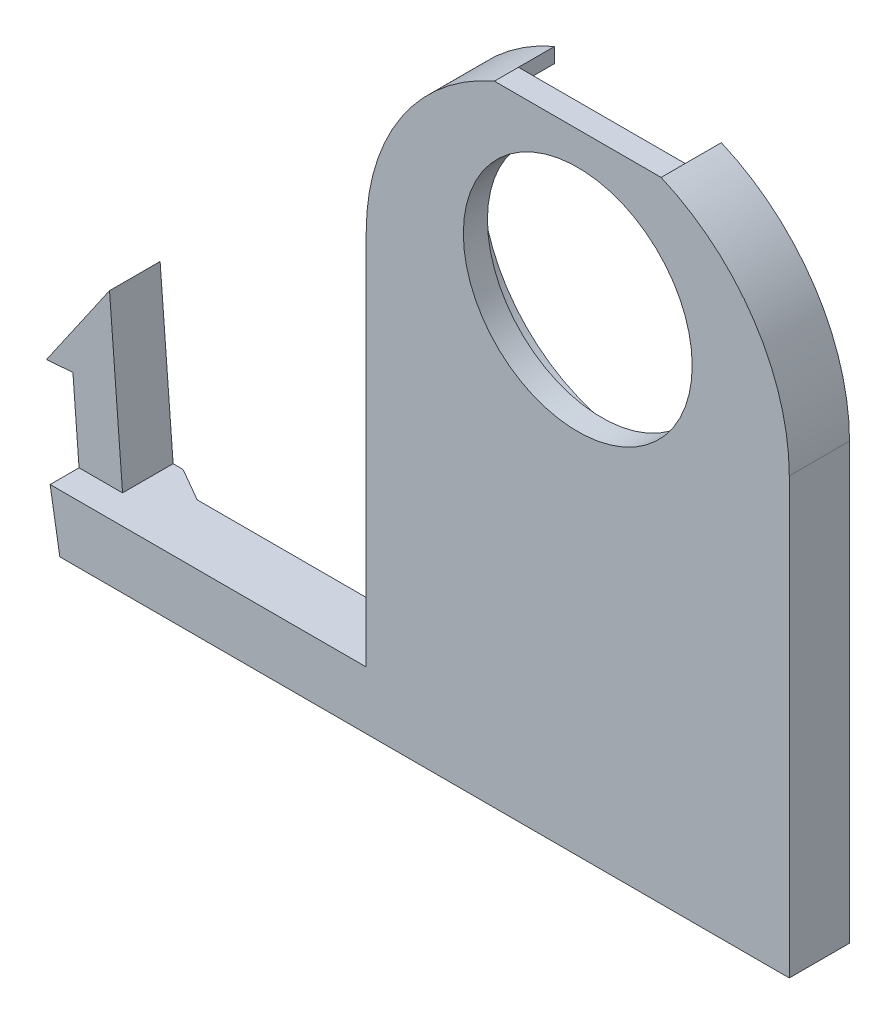
ISO-10303-21;
HEADER;
FILE_DESCRIPTION(('STEP AP214'),'2;1');
FILE_NAME('part.step','',(''),(''),'','','');
FILE_SCHEMA(('AUTOMOTIVE_DESIGN { 1 0 10303 214 1 1 1 1 }'));
ENDSEC;
DATA;
#1=APPLICATION_CONTEXT('core data for automotive mechanical design processes');
#2=APPLICATION_PROTOCOL_DEFINITION('international standard','automotive_design',2000,#1);
#3=PRODUCT_CONTEXT('',#1,'mechanical');
#4=PRODUCT('Part','Part','',(#3));
#5=PRODUCT_RELATED_PRODUCT_CATEGORY('part','',(#4));
#6=PRODUCT_DEFINITION_FORMATION('','',#4);
#7=PRODUCT_DEFINITION_CONTEXT('part definition',#1,'design');
#8=PRODUCT_DEFINITION('design','',#6,#7);
#9=PRODUCT_DEFINITION_SHAPE('','',#8);
#10=(LENGTH_UNIT() NAMED_UNIT(*) SI_UNIT(.MILLI.,.METRE.));
#11=(NAMED_UNIT(*) PLANE_ANGLE_UNIT() SI_UNIT($,.RADIAN.));
#12=(NAMED_UNIT(*) SI_UNIT($,.STERADIAN.) SOLID_ANGLE_UNIT());
#13=UNCERTAINTY_MEASURE_WITH_UNIT(LENGTH_MEASURE(1.E-05),#10,'distance_accuracy_value','');
#14=(GEOMETRIC_REPRESENTATION_CONTEXT(3) GLOBAL_UNCERTAINTY_ASSIGNED_CONTEXT((#13)) GLOBAL_UNIT_ASSIGNED_CONTEXT((#10,
#11,#12)) REPRESENTATION_CONTEXT('',''));
#15=CARTESIAN_POINT('',(0.,0.,0.));
#16=DIRECTION('',(0.,0.,1.));
#17=DIRECTION('',(1.,0.,0.));
#18=AXIS2_PLACEMENT_3D('',#15,#16,#17);
#19=CARTESIAN_POINT('',(0.,0.,1.3));
#20=DIRECTION('',(0.,0.,-1.));
#21=DIRECTION('',(-1.,0.,0.));
#22=AXIS2_PLACEMENT_3D('',#19,#20,#21);
#23=PLANE('',#22);
#24=DIRECTION('',(-0.0769745555350215,0.997033057526272,0.));
#25=VECTOR('',#24,1.);
#26=CARTESIAN_POINT('',(-13.1211903085665,-9.1,1.3));
#27=LINE('',#26,#25);
#28=CARTESIAN_POINT('',(-13.1211903085665,-9.1,1.3));
#29=VERTEX_POINT('',#28);
#30=CARTESIAN_POINT('',(-13.3759622354832,-5.8,1.3));
#31=VERTEX_POINT('',#30);
#32=EDGE_CURVE('E166',#29,#31,#27,.T.);
#33=ORIENTED_EDGE('',*,*,#32,.F.);
#34=DIRECTION('',(-1.,0.,0.));
#35=VECTOR('',#34,1.);
#36=CARTESIAN_POINT('',(-12.72,-9.1,1.3));
#37=LINE('',#36,#35);
#38=CARTESIAN_POINT('',(-11.3158339200171,-9.1,1.3));
#39=VERTEX_POINT('',#38);
#40=EDGE_CURVE('E150',#39,#29,#37,.T.);
#41=ORIENTED_EDGE('',*,*,#40,.F.);
#42=DIRECTION('',(0.0769745555350218,-0.997033057526272,0.));
#43=VECTOR('',#42,1.);
#44=CARTESIAN_POINT('',(-11.8562592195373,-2.1,1.3));
#45=LINE('',#44,#43);
#46=CARTESIAN_POINT('',(-11.8562592195373,-2.1,1.3));
#47=VERTEX_POINT('',#46);
#48=EDGE_CURVE('E162',#47,#39,#45,.T.);
#49=ORIENTED_EDGE('',*,*,#48,.F.);
#50=DIRECTION('',(0.568663566892259,0.822570208364839,0.));
#51=VECTOR('',#50,1.);
#52=CARTESIAN_POINT('',(-14.4726985987621,-5.88467201108852,1.3));
#53=LINE('',#52,#51);
#54=CARTESIAN_POINT('',(-14.4726985987621,-5.88467201108852,1.3));
#55=VERTEX_POINT('',#54);
#56=EDGE_CURVE('E194',#55,#47,#53,.T.);
#57=ORIENTED_EDGE('',*,*,#56,.F.);
#58=DIRECTION('',(-0.997033057526272,-0.0769745555350211,0.));
#59=VECTOR('',#58,1.);
#60=CARTESIAN_POINT('',(-13.3759622354832,-5.8,1.3));
#61=LINE('',#60,#59);
#62=EDGE_CURVE('E170',#31,#55,#61,.T.);
#63=ORIENTED_EDGE('',*,*,#62,.F.);
#64=EDGE_LOOP('',(#33,#41,#49,#57,#63));
#65=FACE_BOUND('',#64,.T.);
#66=ADVANCED_FACE('F35',(#65),#23,.F.);
#67=CARTESIAN_POINT('',(0.,0.,0.));
#68=DIRECTION('',(0.,0.,1.));
#69=DIRECTION('',(1.,0.,0.));
#70=AXIS2_PLACEMENT_3D('',#67,#68,#69);
#71=PLANE('',#70);
#72=DIRECTION('',(1.,0.,0.));
#73=VECTOR('',#72,1.);
#74=CARTESIAN_POINT('',(0.,-11.5,0.));
#75=LINE('',#74,#73);
#76=CARTESIAN_POINT('',(-9.51583392001713,-11.5,0.));
#77=VERTEX_POINT('',#76);
#78=CARTESIAN_POINT('',(17.56,-11.5,0.));
#79=VERTEX_POINT('',#78);
#80=EDGE_CURVE('E224',#77,#79,#75,.T.);
#81=ORIENTED_EDGE('',*,*,#80,.F.);
#82=DIRECTION('',(0.,1.,0.));
#83=VECTOR('',#82,1.);
#84=CARTESIAN_POINT('',(-9.51583392001713,-9.1,0.));
#85=LINE('',#84,#83);
#86=CARTESIAN_POINT('',(-9.51583392001713,-9.1,0.));
#87=VERTEX_POINT('',#86);
#88=EDGE_CURVE('E298',#77,#87,#85,.T.);
#89=ORIENTED_EDGE('',*,*,#88,.T.);
#90=DIRECTION('',(1.,0.,0.));
#91=VECTOR('',#90,1.);
#92=CARTESIAN_POINT('',(-12.72,-9.1,0.));
#93=LINE('',#92,#91);
#94=CARTESIAN_POINT('',(0.,-9.1,0.));
#95=VERTEX_POINT('',#94);
#96=EDGE_CURVE('E215',#87,#95,#93,.T.);
#97=ORIENTED_EDGE('',*,*,#96,.T.);
#98=DIRECTION('',(0.,1.,0.));
#99=VECTOR('',#98,1.);
#100=CARTESIAN_POINT('',(0.,0.,0.));
#101=LINE('',#100,#99);
#102=CARTESIAN_POINT('',(0.,6.55,0.));
#103=VERTEX_POINT('',#102);
#104=EDGE_CURVE('E275',#95,#103,#101,.T.);
#105=ORIENTED_EDGE('',*,*,#104,.T.);
#106=CARTESIAN_POINT('',(8.78,6.55,0.));
#107=DIRECTION('',(0.,0.,1.));
#108=DIRECTION('',(1.,0.,0.));
#109=AXIS2_PLACEMENT_3D('',#106,#107,#108);
#110=CIRCLE('',#109,8.78);
#111=CARTESIAN_POINT('',(5.32,14.6194981256581,0.));
#112=VERTEX_POINT('',#111);
#113=EDGE_CURVE('E272',#112,#103,#110,.T.);
#114=ORIENTED_EDGE('',*,*,#113,.F.);
#115=DIRECTION('',(0.,1.,0.));
#116=VECTOR('',#115,1.);
#117=CARTESIAN_POINT('',(5.32,0.,0.));
#118=LINE('',#117,#116);
#119=CARTESIAN_POINT('',(5.32,14.0025812124856,0.));
#120=VERTEX_POINT('',#119);
#121=EDGE_CURVE('E270',#120,#112,#118,.T.);
#122=ORIENTED_EDGE('',*,*,#121,.F.);
#123=CARTESIAN_POINT('',(8.78,8.5,0.));
#124=DIRECTION('',(0.,0.,1.));
#125=DIRECTION('',(1.,0.,0.));
#126=AXIS2_PLACEMENT_3D('',#123,#124,#125);
#127=CIRCLE('',#126,6.5);
#128=CARTESIAN_POINT('',(12.24,14.0025812124856,0.));
#129=VERTEX_POINT('',#128);
#130=EDGE_CURVE('E257',#120,#129,#127,.T.);
#131=ORIENTED_EDGE('',*,*,#130,.T.);
#132=DIRECTION('',(0.,1.,0.));
#133=VECTOR('',#132,1.);
#134=CARTESIAN_POINT('',(12.24,0.,0.));
#135=LINE('',#134,#133);
#136=CARTESIAN_POINT('',(12.24,14.6194981256581,0.));
#137=VERTEX_POINT('',#136);
#138=EDGE_CURVE('E262',#129,#137,#135,.T.);
#139=ORIENTED_EDGE('',*,*,#138,.T.);
#140=CARTESIAN_POINT('',(8.78,6.55,0.));
#141=DIRECTION('',(0.,0.,1.));
#142=DIRECTION('',(1.,0.,0.));
#143=AXIS2_PLACEMENT_3D('',#140,#141,#142);
#144=CIRCLE('',#143,8.78);
#145=CARTESIAN_POINT('',(17.56,6.55,0.));
#146=VERTEX_POINT('',#145);
#147=EDGE_CURVE('E279',#146,#137,#144,.T.);
#148=ORIENTED_EDGE('',*,*,#147,.F.);
#149=DIRECTION('',(0.,1.,0.));
#150=VECTOR('',#149,1.);
#151=CARTESIAN_POINT('',(17.56,0.,0.));
#152=LINE('',#151,#150);
#153=EDGE_CURVE('E277',#79,#146,#152,.T.);
#154=ORIENTED_EDGE('',*,*,#153,.F.);
#155=EDGE_LOOP('',(#81,#89,#97,#105,#114,#122,#131,#139,#148,#154));
#156=FACE_BOUND('',#155,.T.);
#157=ADVANCED_FACE('F314',(#156),#71,.F.);
#158=CARTESIAN_POINT('',(-12.72,-9.1,0.));
#159=DIRECTION('',(0.,-1.,0.));
#160=DIRECTION('',(0.,0.,-1.));
#161=AXIS2_PLACEMENT_3D('',#158,#159,#160);
#162=PLANE('',#161);
#163=DIRECTION('',(0.,0.,1.));
#164=VECTOR('',#163,1.);
#165=CARTESIAN_POINT('',(-11.3158339200171,-9.1,-0.8));
#166=LINE('',#165,#164);
#167=CARTESIAN_POINT('',(-11.3158339200171,-9.1,-0.8));
#168=VERTEX_POINT('',#167);
#169=EDGE_CURVE('E157',#168,#39,#166,.T.);
#170=ORIENTED_EDGE('',*,*,#169,.T.);
#171=ORIENTED_EDGE('',*,*,#40,.T.);
#172=DIRECTION('',(0.,0.,-1.));
#173=VECTOR('',#172,1.);
#174=CARTESIAN_POINT('',(-13.1211903085665,-9.1,4.93330098090797));
#175=LINE('',#174,#173);
#176=CARTESIAN_POINT('',(-13.1211903085665,-9.1,2.5));
#177=VERTEX_POINT('',#176);
#178=EDGE_CURVE('E154',#177,#29,#175,.T.);
#179=ORIENTED_EDGE('',*,*,#178,.F.);
#180=DIRECTION('',(1.,0.,0.));
#181=VECTOR('',#180,1.);
#182=CARTESIAN_POINT('',(-12.72,-9.1,2.5));
#183=LINE('',#182,#181);
#184=CARTESIAN_POINT('',(0.,-9.1,2.5));
#185=VERTEX_POINT('',#184);
#186=EDGE_CURVE('E219',#177,#185,#183,.T.);
#187=ORIENTED_EDGE('',*,*,#186,.T.);
#188=DIRECTION('',(0.,0.,-1.));
#189=VECTOR('',#188,1.);
#190=CARTESIAN_POINT('',(0.,-9.1,0.));
#191=LINE('',#190,#189);
#192=EDGE_CURVE('E182',#185,#95,#191,.T.);
#193=ORIENTED_EDGE('',*,*,#192,.T.);
#194=ORIENTED_EDGE('',*,*,#96,.F.);
#195=DIRECTION('',(0.866025403784435,0.,0.500000000000006));
#196=VECTOR('',#195,1.);
#197=CARTESIAN_POINT('',(-11.9189584800043,-9.1,-1.3874446116048));
#198=LINE('',#197,#196);
#199=CARTESIAN_POINT('',(-10.9014745660722,-9.1,-0.8));
#200=VERTEX_POINT('',#199);
#201=EDGE_CURVE('E44',#87,#200,#198,.F.);
#202=ORIENTED_EDGE('',*,*,#201,.T.);
#203=DIRECTION('',(1.,0.,0.));
#204=VECTOR('',#203,1.);
#205=CARTESIAN_POINT('',(-12.72,-9.1,-0.8));
#206=LINE('',#205,#204);
#207=EDGE_CURVE('E11',#168,#200,#206,.T.);
#208=ORIENTED_EDGE('',*,*,#207,.F.);
#209=EDGE_LOOP('',(#170,#171,#179,#187,#193,#194,#202,#208));
#210=FACE_BOUND('',#209,.T.);
#211=ADVANCED_FACE('F152',(#210),#162,.F.);
#212=CARTESIAN_POINT('',(0.,0.,1.5));
#213=DIRECTION('',(-1.,0.,0.));
#214=DIRECTION('',(0.,0.,1.));
#215=AXIS2_PLACEMENT_3D('',#212,#213,#214);
#216=PLANE('',#215);
#217=ORIENTED_EDGE('',*,*,#104,.F.);
#218=ORIENTED_EDGE('',*,*,#192,.F.);
#219=DIRECTION('',(0.,-1.,0.));
#220=VECTOR('',#219,1.);
#221=CARTESIAN_POINT('',(0.,0.,2.5));
#222=LINE('',#221,#220);
#223=CARTESIAN_POINT('',(0.,6.55,2.5));
#224=VERTEX_POINT('',#223);
#225=EDGE_CURVE('E244',#224,#185,#222,.T.);
#226=ORIENTED_EDGE('',*,*,#225,.F.);
#227=DIRECTION('',(0.,0.,-1.));
#228=VECTOR('',#227,1.);
#229=CARTESIAN_POINT('',(0.,6.55,1.5));
#230=LINE('',#229,#228);
#231=EDGE_CURVE('E290',#224,#103,#230,.T.);
#232=ORIENTED_EDGE('',*,*,#231,.T.);
#233=EDGE_LOOP('',(#217,#218,#226,#232));
#234=FACE_BOUND('',#233,.T.);
#235=ADVANCED_FACE('F337',(#234),#216,.T.);
#236=CARTESIAN_POINT('',(8.78,8.5,1.5));
#237=DIRECTION('',(0.,0.,-1.));
#238=DIRECTION('',(-1.,0.,0.));
#239=AXIS2_PLACEMENT_3D('',#236,#237,#238);
#240=CYLINDRICAL_SURFACE('',#239,6.5);
#241=ORIENTED_EDGE('',*,*,#130,.F.);
#242=DIRECTION('',(0.,0.,-1.));
#243=VECTOR('',#242,1.);
#244=CARTESIAN_POINT('',(5.32,14.0025812124856,1.5));
#245=LINE('',#244,#243);
#246=CARTESIAN_POINT('',(5.32,14.0025812124856,1.5));
#247=VERTEX_POINT('',#246);
#248=EDGE_CURVE('E296',#247,#120,#245,.T.);
#249=ORIENTED_EDGE('',*,*,#248,.F.);
#250=CARTESIAN_POINT('',(8.78,8.5,1.5));
#251=DIRECTION('',(0.,0.,1.));
#252=DIRECTION('',(1.,0.,0.));
#253=AXIS2_PLACEMENT_3D('',#250,#251,#252);
#254=CIRCLE('',#253,6.5);
#255=CARTESIAN_POINT('',(12.24,14.0025812124856,1.5));
#256=VERTEX_POINT('',#255);
#257=EDGE_CURVE('E258',#247,#256,#254,.T.);
#258=ORIENTED_EDGE('',*,*,#257,.T.);
#259=DIRECTION('',(0.,0.,-1.));
#260=VECTOR('',#259,1.);
#261=CARTESIAN_POINT('',(12.24,14.0025812124856,1.5));
#262=LINE('',#261,#260);
#263=EDGE_CURVE('E267',#256,#129,#262,.T.);
#264=ORIENTED_EDGE('',*,*,#263,.T.);
#265=EDGE_LOOP('',(#241,#249,#258,#264));
#266=FACE_BOUND('',#265,.T.);
#267=ADVANCED_FACE('F351',(#266),#240,.F.);
#268=CARTESIAN_POINT('',(5.32,0.,1.5));
#269=DIRECTION('',(-1.,0.,0.));
#270=DIRECTION('',(0.,0.,1.));
#271=AXIS2_PLACEMENT_3D('',#268,#269,#270);
#272=PLANE('',#271);
#273=ORIENTED_EDGE('',*,*,#121,.T.);
#274=DIRECTION('',(0.,0.,-1.));
#275=VECTOR('',#274,1.);
#276=CARTESIAN_POINT('',(5.32,14.6194981256581,1.5));
#277=LINE('',#276,#275);
#278=CARTESIAN_POINT('',(5.32,14.6194981256581,1.5));
#279=VERTEX_POINT('',#278);
#280=EDGE_CURVE('E293',#279,#112,#277,.T.);
#281=ORIENTED_EDGE('',*,*,#280,.F.);
#282=DIRECTION('',(0.,1.,0.));
#283=VECTOR('',#282,1.);
#284=CARTESIAN_POINT('',(5.32,0.,1.5));
#285=LINE('',#284,#283);
#286=EDGE_CURVE('E261',#247,#279,#285,.T.);
#287=ORIENTED_EDGE('',*,*,#286,.F.);
#288=ORIENTED_EDGE('',*,*,#248,.T.);
#289=EDGE_LOOP('',(#273,#281,#287,#288));
#290=FACE_BOUND('',#289,.T.);
#291=ADVANCED_FACE('F348',(#290),#272,.F.);
#292=CARTESIAN_POINT('',(8.78,6.55,1.5));
#293=DIRECTION('',(0.,0.,-1.));
#294=DIRECTION('',(-1.,0.,0.));
#295=AXIS2_PLACEMENT_3D('',#292,#293,#294);
#296=CYLINDRICAL_SURFACE('',#295,8.78);
#297=ORIENTED_EDGE('',*,*,#113,.T.);
#298=ORIENTED_EDGE('',*,*,#231,.F.);
#299=CARTESIAN_POINT('',(8.78,6.55,2.5));
#300=DIRECTION('',(0.,0.,1.));
#301=DIRECTION('',(1.,0.,0.));
#302=AXIS2_PLACEMENT_3D('',#299,#300,#301);
#303=CIRCLE('',#302,8.78);
#304=CARTESIAN_POINT('',(5.32,14.6194981256581,2.5));
#305=VERTEX_POINT('',#304);
#306=EDGE_CURVE('E241',#305,#224,#303,.T.);
#307=ORIENTED_EDGE('',*,*,#306,.F.);
#308=DIRECTION('',(0.,0.,-1.));
#309=VECTOR('',#308,1.);
#310=CARTESIAN_POINT('',(5.32,14.6194981256581,2.5));
#311=LINE('',#310,#309);
#312=EDGE_CURVE('E250',#305,#279,#311,.T.);
#313=ORIENTED_EDGE('',*,*,#312,.T.);
#314=ORIENTED_EDGE('',*,*,#280,.T.);
#315=EDGE_LOOP('',(#297,#298,#307,#313,#314));
#316=FACE_BOUND('',#315,.T.);
#317=ADVANCED_FACE('F342',(#316),#296,.T.);
#318=CARTESIAN_POINT('',(17.56,0.,1.5));
#319=DIRECTION('',(-1.,0.,0.));
#320=DIRECTION('',(0.,0.,1.));
#321=AXIS2_PLACEMENT_3D('',#318,#319,#320);
#322=PLANE('',#321);
#323=ORIENTED_EDGE('',*,*,#153,.T.);
#324=DIRECTION('',(0.,0.,-1.));
#325=VECTOR('',#324,1.);
#326=CARTESIAN_POINT('',(17.56,6.55,1.5));
#327=LINE('',#326,#325);
#328=CARTESIAN_POINT('',(17.56,6.55,2.5));
#329=VERTEX_POINT('',#328);
#330=EDGE_CURVE('E287',#329,#146,#327,.T.);
#331=ORIENTED_EDGE('',*,*,#330,.F.);
#332=DIRECTION('',(0.,1.,0.));
#333=VECTOR('',#332,1.);
#334=CARTESIAN_POINT('',(17.56,0.,2.5));
#335=LINE('',#334,#333);
#336=CARTESIAN_POINT('',(17.56,-11.5,2.5));
#337=VERTEX_POINT('',#336);
#338=EDGE_CURVE('E247',#337,#329,#335,.T.);
#339=ORIENTED_EDGE('',*,*,#338,.F.);
#340=DIRECTION('',(0.,0.,1.));
#341=VECTOR('',#340,1.);
#342=CARTESIAN_POINT('',(17.56,-11.5,0.));
#343=LINE('',#342,#341);
#344=EDGE_CURVE('E226',#79,#337,#343,.T.);
#345=ORIENTED_EDGE('',*,*,#344,.F.);
#346=EDGE_LOOP('',(#323,#331,#339,#345));
#347=FACE_BOUND('',#346,.T.);
#348=ADVANCED_FACE('F362',(#347),#322,.F.);
#349=CARTESIAN_POINT('',(8.78,6.55,1.5));
#350=DIRECTION('',(0.,0.,-1.));
#351=DIRECTION('',(-1.,0.,0.));
#352=AXIS2_PLACEMENT_3D('',#349,#350,#351);
#353=CYLINDRICAL_SURFACE('',#352,8.78);
#354=ORIENTED_EDGE('',*,*,#147,.T.);
#355=DIRECTION('',(0.,0.,-1.));
#356=VECTOR('',#355,1.);
#357=CARTESIAN_POINT('',(12.24,14.6194981256581,1.5));
#358=LINE('',#357,#356);
#359=CARTESIAN_POINT('',(12.24,14.6194981256581,1.5));
#360=VERTEX_POINT('',#359);
#361=EDGE_CURVE('E285',#360,#137,#358,.T.);
#362=ORIENTED_EDGE('',*,*,#361,.F.);
#363=DIRECTION('',(0.,0.,-1.));
#364=VECTOR('',#363,1.);
#365=CARTESIAN_POINT('',(12.24,14.6194981256581,2.5));
#366=LINE('',#365,#364);
#367=CARTESIAN_POINT('',(12.24,14.6194981256581,2.5));
#368=VERTEX_POINT('',#367);
#369=EDGE_CURVE('E254',#368,#360,#366,.T.);
#370=ORIENTED_EDGE('',*,*,#369,.F.);
#371=CARTESIAN_POINT('',(8.78,6.55,2.5));
#372=DIRECTION('',(0.,0.,1.));
#373=DIRECTION('',(1.,0.,0.));
#374=AXIS2_PLACEMENT_3D('',#371,#372,#373);
#375=CIRCLE('',#374,8.78);
#376=EDGE_CURVE('E236',#329,#368,#375,.T.);
#377=ORIENTED_EDGE('',*,*,#376,.F.);
#378=ORIENTED_EDGE('',*,*,#330,.T.);
#379=EDGE_LOOP('',(#354,#362,#370,#377,#378));
#380=FACE_BOUND('',#379,.T.);
#381=ADVANCED_FACE('F359',(#380),#353,.T.);
#382=CARTESIAN_POINT('',(12.24,0.,1.5));
#383=DIRECTION('',(-1.,0.,0.));
#384=DIRECTION('',(0.,0.,1.));
#385=AXIS2_PLACEMENT_3D('',#382,#383,#384);
#386=PLANE('',#385);
#387=ORIENTED_EDGE('',*,*,#138,.F.);
#388=ORIENTED_EDGE('',*,*,#263,.F.);
#389=DIRECTION('',(0.,1.,0.));
#390=VECTOR('',#389,1.);
#391=CARTESIAN_POINT('',(12.24,0.,1.5));
#392=LINE('',#391,#390);
#393=EDGE_CURVE('E264',#256,#360,#392,.T.);
#394=ORIENTED_EDGE('',*,*,#393,.T.);
#395=ORIENTED_EDGE('',*,*,#361,.T.);
#396=EDGE_LOOP('',(#387,#388,#394,#395));
#397=FACE_BOUND('',#396,.T.);
#398=ADVANCED_FACE('F355',(#397),#386,.T.);
#399=CARTESIAN_POINT('',(0.,0.,1.5));
#400=DIRECTION('',(0.,0.,1.));
#401=DIRECTION('',(1.,0.,0.));
#402=AXIS2_PLACEMENT_3D('',#399,#400,#401);
#403=PLANE('',#402);
#404=CARTESIAN_POINT('',(8.78,8.5,1.5));
#405=DIRECTION('',(0.,0.,-1.));
#406=DIRECTION('',(-1.,0.,0.));
#407=AXIS2_PLACEMENT_3D('',#404,#405,#406);
#408=CIRCLE('',#407,4.75);
#409=CARTESIAN_POINT('',(4.03,8.5,1.5));
#410=VERTEX_POINT('',#409);
#411=EDGE_CURVE('E229',#410,#410,#408,.T.);
#412=ORIENTED_EDGE('',*,*,#411,.F.);
#413=EDGE_LOOP('',(#412));
#414=FACE_BOUND('',#413,.T.);
#415=ORIENTED_EDGE('',*,*,#257,.F.);
#416=ORIENTED_EDGE('',*,*,#286,.T.);
#417=DIRECTION('',(1.,0.,0.));
#418=VECTOR('',#417,1.);
#419=CARTESIAN_POINT('',(0.,14.6194981256581,1.5));
#420=LINE('',#419,#418);
#421=EDGE_CURVE('E233',#279,#360,#420,.T.);
#422=ORIENTED_EDGE('',*,*,#421,.T.);
#423=ORIENTED_EDGE('',*,*,#393,.F.);
#424=EDGE_LOOP('',(#415,#416,#422,#423));
#425=FACE_BOUND('',#424,.T.);
#426=ADVANCED_FACE('F367',(#414,#425),#403,.F.);
#427=CARTESIAN_POINT('',(0.,14.6194981256581,2.5));
#428=DIRECTION('',(0.,1.,0.));
#429=DIRECTION('',(0.,0.,1.));
#430=AXIS2_PLACEMENT_3D('',#427,#428,#429);
#431=PLANE('',#430);
#432=ORIENTED_EDGE('',*,*,#421,.F.);
#433=ORIENTED_EDGE('',*,*,#312,.F.);
#434=DIRECTION('',(1.,0.,0.));
#435=VECTOR('',#434,1.);
#436=CARTESIAN_POINT('',(0.,14.6194981256581,2.5));
#437=LINE('',#436,#435);
#438=EDGE_CURVE('E238',#305,#368,#437,.T.);
#439=ORIENTED_EDGE('',*,*,#438,.T.);
#440=ORIENTED_EDGE('',*,*,#369,.T.);
#441=EDGE_LOOP('',(#432,#433,#439,#440));
#442=FACE_BOUND('',#441,.T.);
#443=ADVANCED_FACE('F365',(#442),#431,.T.);
#444=CARTESIAN_POINT('',(0.,0.,2.5));
#445=DIRECTION('',(0.,0.,1.));
#446=DIRECTION('',(1.,0.,0.));
#447=AXIS2_PLACEMENT_3D('',#444,#445,#446);
#448=PLANE('',#447);
#449=CARTESIAN_POINT('',(8.78,8.5,2.5));
#450=DIRECTION('',(0.,0.,-1.));
#451=DIRECTION('',(-1.,0.,0.));
#452=AXIS2_PLACEMENT_3D('',#449,#450,#451);
#453=CIRCLE('',#452,4.75);
#454=CARTESIAN_POINT('',(4.03,8.5,2.5));
#455=VERTEX_POINT('',#454);
#456=EDGE_CURVE('E230',#455,#455,#453,.T.);
#457=ORIENTED_EDGE('',*,*,#456,.T.);
#458=EDGE_LOOP('',(#457));
#459=FACE_BOUND('',#458,.T.);
#460=ORIENTED_EDGE('',*,*,#376,.T.);
#461=ORIENTED_EDGE('',*,*,#438,.F.);
#462=ORIENTED_EDGE('',*,*,#306,.T.);
#463=ORIENTED_EDGE('',*,*,#225,.T.);
#464=ORIENTED_EDGE('',*,*,#186,.F.);
#465=DIRECTION('',(0.16487492164526,-0.986314483424262,0.));
#466=VECTOR('',#465,1.);
#467=CARTESIAN_POINT('',(-13.1211903085665,-9.1,2.5));
#468=LINE('',#467,#466);
#469=CARTESIAN_POINT('',(-12.72,-11.5,2.5));
#470=VERTEX_POINT('',#469);
#471=EDGE_CURVE('E187',#177,#470,#468,.T.);
#472=ORIENTED_EDGE('',*,*,#471,.T.);
#473=DIRECTION('',(-1.,0.,0.));
#474=VECTOR('',#473,1.);
#475=CARTESIAN_POINT('',(17.56,-11.5,2.5));
#476=LINE('',#475,#474);
#477=EDGE_CURVE('E221',#337,#470,#476,.T.);
#478=ORIENTED_EDGE('',*,*,#477,.F.);
#479=ORIENTED_EDGE('',*,*,#338,.T.);
#480=EDGE_LOOP('',(#460,#461,#462,#463,#464,#472,#478,#479));
#481=FACE_BOUND('',#480,.T.);
#482=ADVANCED_FACE('F332',(#459,#481),#448,.T.);
#483=CARTESIAN_POINT('',(8.78,8.5,2.5));
#484=DIRECTION('',(0.,0.,-1.));
#485=DIRECTION('',(-1.,0.,0.));
#486=AXIS2_PLACEMENT_3D('',#483,#484,#485);
#487=CYLINDRICAL_SURFACE('',#486,4.75);
#488=ORIENTED_EDGE('',*,*,#456,.F.);
#489=EDGE_LOOP('',(#488));
#490=FACE_BOUND('',#489,.T.);
#491=ORIENTED_EDGE('',*,*,#411,.T.);
#492=EDGE_LOOP('',(#491));
#493=FACE_BOUND('',#492,.T.);
#494=ADVANCED_FACE('F403',(#490,#493),#487,.F.);
#495=CARTESIAN_POINT('',(0.,-11.5,0.));
#496=DIRECTION('',(0.,-1.,0.));
#497=DIRECTION('',(0.,0.,-1.));
#498=AXIS2_PLACEMENT_3D('',#495,#496,#497);
#499=PLANE('',#498);
#500=ORIENTED_EDGE('',*,*,#477,.T.);
#501=DIRECTION('',(0.,0.,1.));
#502=VECTOR('',#501,1.);
#503=CARTESIAN_POINT('',(-12.72,-11.5,0.));
#504=LINE('',#503,#502);
#505=CARTESIAN_POINT('',(-12.72,-11.5,-0.8));
#506=VERTEX_POINT('',#505);
#507=EDGE_CURVE('E213',#506,#470,#504,.T.);
#508=ORIENTED_EDGE('',*,*,#507,.F.);
#509=DIRECTION('',(-1.,0.,0.));
#510=VECTOR('',#509,1.);
#511=CARTESIAN_POINT('',(-11.3158339200171,-11.5,-0.8));
#512=LINE('',#511,#510);
#513=CARTESIAN_POINT('',(-10.9014745660722,-11.5,-0.8));
#514=VERTEX_POINT('',#513);
#515=EDGE_CURVE('E173',#514,#506,#512,.T.);
#516=ORIENTED_EDGE('',*,*,#515,.F.);
#517=DIRECTION('',(-0.866025403784435,0.,-0.500000000000006));
#518=VECTOR('',#517,1.);
#519=CARTESIAN_POINT('',(-11.3158339200171,-11.5,-1.03923048454135));
#520=LINE('',#519,#518);
#521=EDGE_CURVE('E304',#514,#77,#520,.F.);
#522=ORIENTED_EDGE('',*,*,#521,.T.);
#523=ORIENTED_EDGE('',*,*,#80,.T.);
#524=ORIENTED_EDGE('',*,*,#344,.T.);
#525=EDGE_LOOP('',(#500,#508,#516,#522,#523,#524));
#526=FACE_BOUND('',#525,.T.);
#527=ADVANCED_FACE('F308',(#526),#499,.T.);
#528=CARTESIAN_POINT('',(-13.1211903085665,-9.1,-0.8));
#529=DIRECTION('',(0.986314483424262,0.16487492164526,0.));
#530=DIRECTION('',(-0.16487492164526,0.986314483424263,0.));
#531=AXIS2_PLACEMENT_3D('',#528,#529,#530);
#532=PLANE('',#531);
#533=DIRECTION('',(-0.16487492164526,0.986314483424262,0.));
#534=VECTOR('',#533,1.);
#535=CARTESIAN_POINT('',(-13.1211903085665,-9.1,-0.8));
#536=LINE('',#535,#534);
#537=CARTESIAN_POINT('',(-13.1211903085665,-9.1,-0.8));
#538=VERTEX_POINT('',#537);
#539=EDGE_CURVE('E161',#506,#538,#536,.T.);
#540=ORIENTED_EDGE('',*,*,#539,.F.);
#541=ORIENTED_EDGE('',*,*,#507,.T.);
#542=ORIENTED_EDGE('',*,*,#471,.F.);
#543=ORIENTED_EDGE('',*,*,#178,.T.);
#544=DIRECTION('',(0.,0.,1.));
#545=VECTOR('',#544,1.);
#546=CARTESIAN_POINT('',(-13.1211903085665,-9.1,-0.8));
#547=LINE('',#546,#545);
#548=EDGE_CURVE('E176',#538,#29,#547,.T.);
#549=ORIENTED_EDGE('',*,*,#548,.F.);
#550=EDGE_LOOP('',(#540,#541,#542,#543,#549));
#551=FACE_BOUND('',#550,.T.);
#552=ADVANCED_FACE('F185',(#551),#532,.F.);
#553=CARTESIAN_POINT('',(-13.1211903085665,-9.1,-0.8));
#554=DIRECTION('',(0.997033057526272,0.0769745555350215,0.));
#555=DIRECTION('',(-0.0769745555350216,0.997033057526272,0.));
#556=AXIS2_PLACEMENT_3D('',#553,#554,#555);
#557=PLANE('',#556);
#558=ORIENTED_EDGE('',*,*,#548,.T.);
#559=ORIENTED_EDGE('',*,*,#32,.T.);
#560=DIRECTION('',(0.,0.,1.));
#561=VECTOR('',#560,1.);
#562=CARTESIAN_POINT('',(-13.3759622354832,-5.8,-0.8));
#563=LINE('',#562,#561);
#564=CARTESIAN_POINT('',(-13.3759622354832,-5.8,-0.8));
#565=VERTEX_POINT('',#564);
#566=EDGE_CURVE('E183',#565,#31,#563,.T.);
#567=ORIENTED_EDGE('',*,*,#566,.F.);
#568=DIRECTION('',(-0.0769745555350215,0.997033057526272,0.));
#569=VECTOR('',#568,1.);
#570=CARTESIAN_POINT('',(-13.1211903085665,-9.1,-0.8));
#571=LINE('',#570,#569);
#572=EDGE_CURVE('E178',#538,#565,#571,.T.);
#573=ORIENTED_EDGE('',*,*,#572,.F.);
#574=EDGE_LOOP('',(#558,#559,#567,#573));
#575=FACE_BOUND('',#574,.T.);
#576=ADVANCED_FACE('F177',(#575),#557,.F.);
#577=CARTESIAN_POINT('',(-13.3759622354832,-5.8,-0.8));
#578=DIRECTION('',(-0.0769745555350211,0.997033057526272,0.));
#579=DIRECTION('',(-0.997033057526272,-0.0769745555350211,0.));
#580=AXIS2_PLACEMENT_3D('',#577,#578,#579);
#581=PLANE('',#580);
#582=ORIENTED_EDGE('',*,*,#566,.T.);
#583=ORIENTED_EDGE('',*,*,#62,.T.);
#584=DIRECTION('',(0.,0.,1.));
#585=VECTOR('',#584,1.);
#586=CARTESIAN_POINT('',(-14.4726985987621,-5.88467201108852,-0.8));
#587=LINE('',#586,#585);
#588=CARTESIAN_POINT('',(-14.4726985987621,-5.88467201108852,-0.8));
#589=VERTEX_POINT('',#588);
#590=EDGE_CURVE('E210',#589,#55,#587,.T.);
#591=ORIENTED_EDGE('',*,*,#590,.F.);
#592=DIRECTION('',(-0.997033057526272,-0.0769745555350211,0.));
#593=VECTOR('',#592,1.);
#594=CARTESIAN_POINT('',(-13.3759622354832,-5.8,-0.8));
#595=LINE('',#594,#593);
#596=EDGE_CURVE('E200',#565,#589,#595,.T.);
#597=ORIENTED_EDGE('',*,*,#596,.F.);
#598=EDGE_LOOP('',(#582,#583,#591,#597));
#599=FACE_BOUND('',#598,.T.);
#600=ADVANCED_FACE('F329',(#599),#581,.F.);
#601=CARTESIAN_POINT('',(-14.4726985987621,-5.88467201108852,-0.8));
#602=DIRECTION('',(0.822570208364838,-0.568663566892258,0.));
#603=DIRECTION('',(0.568663566892259,0.822570208364839,0.));
#604=AXIS2_PLACEMENT_3D('',#601,#602,#603);
#605=PLANE('',#604);
#606=ORIENTED_EDGE('',*,*,#590,.T.);
#607=ORIENTED_EDGE('',*,*,#56,.T.);
#608=DIRECTION('',(0.,0.,1.));
#609=VECTOR('',#608,1.);
#610=CARTESIAN_POINT('',(-11.8562592195373,-2.1,-0.8));
#611=LINE('',#610,#609);
#612=CARTESIAN_POINT('',(-11.8562592195373,-2.1,-0.8));
#613=VERTEX_POINT('',#612);
#614=EDGE_CURVE('E208',#613,#47,#611,.T.);
#615=ORIENTED_EDGE('',*,*,#614,.F.);
#616=DIRECTION('',(0.568663566892259,0.822570208364839,0.));
#617=VECTOR('',#616,1.);
#618=CARTESIAN_POINT('',(-14.4726985987621,-5.88467201108852,-0.8));
#619=LINE('',#618,#617);
#620=EDGE_CURVE('E202',#589,#613,#619,.T.);
#621=ORIENTED_EDGE('',*,*,#620,.F.);
#622=EDGE_LOOP('',(#606,#607,#615,#621));
#623=FACE_BOUND('',#622,.T.);
#624=ADVANCED_FACE('F324',(#623),#605,.F.);
#625=CARTESIAN_POINT('',(-11.8562592195373,-2.1,-0.8));
#626=DIRECTION('',(-0.997033057526272,-0.0769745555350218,0.));
#627=DIRECTION('',(0.0769745555350219,-0.997033057526272,0.));
#628=AXIS2_PLACEMENT_3D('',#625,#626,#627);
#629=PLANE('',#628);
#630=ORIENTED_EDGE('',*,*,#614,.T.);
#631=ORIENTED_EDGE('',*,*,#48,.T.);
#632=ORIENTED_EDGE('',*,*,#169,.F.);
#633=DIRECTION('',(0.0769745555350218,-0.997033057526272,0.));
#634=VECTOR('',#633,1.);
#635=CARTESIAN_POINT('',(-11.8562592195373,-2.1,-0.8));
#636=LINE('',#635,#634);
#637=EDGE_CURVE('E204',#613,#168,#636,.T.);
#638=ORIENTED_EDGE('',*,*,#637,.F.);
#639=EDGE_LOOP('',(#630,#631,#632,#638));
#640=FACE_BOUND('',#639,.T.);
#641=ADVANCED_FACE('F321',(#640),#629,.F.);
#642=CARTESIAN_POINT('',(0.,0.,-0.8));
#643=DIRECTION('',(0.,0.,-1.));
#644=DIRECTION('',(-1.,0.,0.));
#645=AXIS2_PLACEMENT_3D('',#642,#643,#644);
#646=PLANE('',#645);
#647=ORIENTED_EDGE('',*,*,#515,.T.);
#648=ORIENTED_EDGE('',*,*,#539,.T.);
#649=ORIENTED_EDGE('',*,*,#572,.T.);
#650=ORIENTED_EDGE('',*,*,#596,.T.);
#651=ORIENTED_EDGE('',*,*,#620,.T.);
#652=ORIENTED_EDGE('',*,*,#637,.T.);
#653=ORIENTED_EDGE('',*,*,#207,.T.);
#654=DIRECTION('',(0.,1.,0.));
#655=VECTOR('',#654,1.);
#656=CARTESIAN_POINT('',(-10.9014745660722,-9.1,-0.8));
#657=LINE('',#656,#655);
#658=EDGE_CURVE('E301',#200,#514,#657,.F.);
#659=ORIENTED_EDGE('',*,*,#658,.T.);
#660=EDGE_LOOP('',(#647,#648,#649,#650,#651,#652,#653,#659));
#661=FACE_BOUND('',#660,.T.);
#662=ADVANCED_FACE('F318',(#661),#646,.T.);
#663=CARTESIAN_POINT('',(-11.3158339200171,-9.1,-1.03923048454135));
#664=DIRECTION('',(0.500000000000006,0.,-0.866025403784435));
#665=DIRECTION('',(0.,1.,0.));
#666=AXIS2_PLACEMENT_3D('',#663,#664,#665);
#667=PLANE('',#666);
#668=ORIENTED_EDGE('',*,*,#201,.F.);
#669=ORIENTED_EDGE('',*,*,#88,.F.);
#670=ORIENTED_EDGE('',*,*,#521,.F.);
#671=ORIENTED_EDGE('',*,*,#658,.F.);
#672=EDGE_LOOP('',(#668,#669,#670,#671));
#673=FACE_BOUND('',#672,.T.);
#674=ADVANCED_FACE('F37',(#673),#667,.T.);
#675=CLOSED_SHELL('',(#66,#157,#211,#235,#267,#291,#317,#348,#381,#398,#426,#443,#482,#494,#527,
#552,#576,#600,#624,#641,#662,#674));
#676=MANIFOLD_SOLID_BREP('B2',#675);
#677=ADVANCED_BREP_SHAPE_REPRESENTATION('',(#18,#676),#14);
#678=SHAPE_DEFINITION_REPRESENTATION(#9,#677);
ENDSEC;
END-ISO-10303-21;
